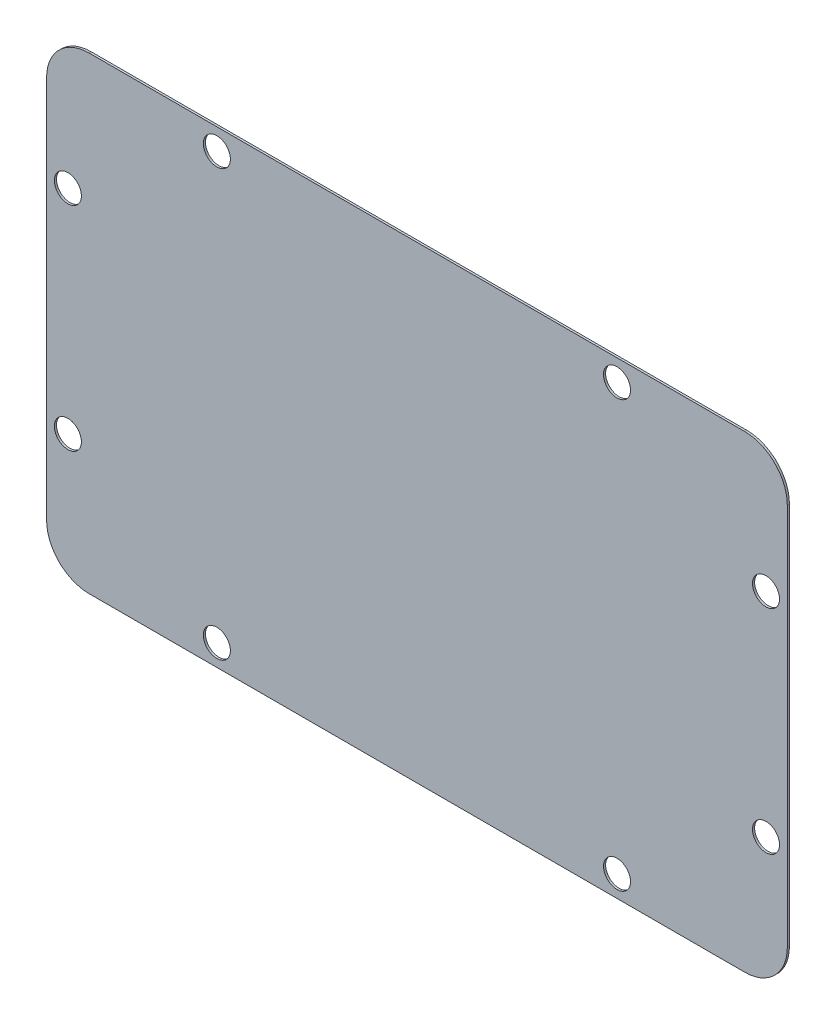
ISO-10303-21;
HEADER;
FILE_DESCRIPTION(('STEP AP214'),'2;1');
FILE_NAME('part.step','',(''),(''),'','','');
FILE_SCHEMA(('AUTOMOTIVE_DESIGN { 1 0 10303 214 1 1 1 1 }'));
ENDSEC;
DATA;
#1=APPLICATION_CONTEXT('core data for automotive mechanical design processes');
#2=APPLICATION_PROTOCOL_DEFINITION('international standard','automotive_design',2000,#1);
#3=PRODUCT_CONTEXT('',#1,'mechanical');
#4=PRODUCT('Part','Part','',(#3));
#5=PRODUCT_RELATED_PRODUCT_CATEGORY('part','',(#4));
#6=PRODUCT_DEFINITION_FORMATION('','',#4);
#7=PRODUCT_DEFINITION_CONTEXT('part definition',#1,'design');
#8=PRODUCT_DEFINITION('design','',#6,#7);
#9=PRODUCT_DEFINITION_SHAPE('','',#8);
#10=(LENGTH_UNIT() NAMED_UNIT(*) SI_UNIT(.MILLI.,.METRE.));
#11=(NAMED_UNIT(*) PLANE_ANGLE_UNIT() SI_UNIT($,.RADIAN.));
#12=(NAMED_UNIT(*) SI_UNIT($,.STERADIAN.) SOLID_ANGLE_UNIT());
#13=UNCERTAINTY_MEASURE_WITH_UNIT(LENGTH_MEASURE(1.E-05),#10,'distance_accuracy_value','');
#14=(GEOMETRIC_REPRESENTATION_CONTEXT(3) GLOBAL_UNCERTAINTY_ASSIGNED_CONTEXT((#13)) GLOBAL_UNIT_ASSIGNED_CONTEXT((#10,
#11,#12)) REPRESENTATION_CONTEXT('',''));
#15=CARTESIAN_POINT('',(0.,0.,0.));
#16=DIRECTION('',(0.,0.,1.));
#17=DIRECTION('',(1.,0.,0.));
#18=AXIS2_PLACEMENT_3D('',#15,#16,#17);
#19=CARTESIAN_POINT('',(-10.,10.,0.5));
#20=DIRECTION('',(0.,0.,-1.));
#21=DIRECTION('',(-1.,0.,0.));
#22=AXIS2_PLACEMENT_3D('',#19,#20,#21);
#23=CYLINDRICAL_SURFACE('',#22,10.);
#24=CARTESIAN_POINT('',(-10.,10.,0.));
#25=DIRECTION('',(0.,0.,1.));
#26=DIRECTION('',(1.,0.,0.));
#27=AXIS2_PLACEMENT_3D('',#24,#25,#26);
#28=CIRCLE('',#27,10.);
#29=CARTESIAN_POINT('',(-10.0000000000001,0.,0.));
#30=VERTEX_POINT('',#29);
#31=CARTESIAN_POINT('',(0.,10.0000000000001,0.));
#32=VERTEX_POINT('',#31);
#33=EDGE_CURVE('E132',#30,#32,#28,.T.);
#34=ORIENTED_EDGE('',*,*,#33,.T.);
#35=DIRECTION('',(0.,0.,-1.));
#36=VECTOR('',#35,1.);
#37=CARTESIAN_POINT('',(0.,10.0000000000001,0.5));
#38=LINE('',#37,#36);
#39=CARTESIAN_POINT('',(0.,10.0000000000001,0.5));
#40=VERTEX_POINT('',#39);
#41=EDGE_CURVE('E11',#40,#32,#38,.T.);
#42=ORIENTED_EDGE('',*,*,#41,.F.);
#43=CARTESIAN_POINT('',(-10.,10.,0.5));
#44=DIRECTION('',(0.,0.,1.));
#45=DIRECTION('',(1.,0.,0.));
#46=AXIS2_PLACEMENT_3D('',#43,#44,#45);
#47=CIRCLE('',#46,10.);
#48=CARTESIAN_POINT('',(-10.0000000000001,0.,0.5));
#49=VERTEX_POINT('',#48);
#50=EDGE_CURVE('E147',#49,#40,#47,.T.);
#51=ORIENTED_EDGE('',*,*,#50,.F.);
#52=DIRECTION('',(0.,0.,-1.));
#53=VECTOR('',#52,1.);
#54=CARTESIAN_POINT('',(-10.0000000000001,0.,0.5));
#55=LINE('',#54,#53);
#56=EDGE_CURVE('E128',#49,#30,#55,.T.);
#57=ORIENTED_EDGE('',*,*,#56,.T.);
#58=EDGE_LOOP('',(#34,#42,#51,#57));
#59=FACE_BOUND('',#58,.T.);
#60=ADVANCED_FACE('F34',(#59),#23,.T.);
#61=CARTESIAN_POINT('',(0.,10.0000000000001,0.5));
#62=DIRECTION('',(-1.,0.,0.));
#63=DIRECTION('',(0.,0.,1.));
#64=AXIS2_PLACEMENT_3D('',#61,#62,#63);
#65=PLANE('',#64);
#66=DIRECTION('',(0.,1.,0.));
#67=VECTOR('',#66,1.);
#68=CARTESIAN_POINT('',(0.,10.0000000000001,0.));
#69=LINE('',#68,#67);
#70=CARTESIAN_POINT('',(0.,100.,0.));
#71=VERTEX_POINT('',#70);
#72=EDGE_CURVE('E135',#32,#71,#69,.T.);
#73=ORIENTED_EDGE('',*,*,#72,.T.);
#74=DIRECTION('',(0.,0.,-1.));
#75=VECTOR('',#74,1.);
#76=CARTESIAN_POINT('',(0.,100.,0.5));
#77=LINE('',#76,#75);
#78=CARTESIAN_POINT('',(0.,100.,0.5));
#79=VERTEX_POINT('',#78);
#80=EDGE_CURVE('E43',#79,#71,#77,.T.);
#81=ORIENTED_EDGE('',*,*,#80,.F.);
#82=DIRECTION('',(0.,1.,0.));
#83=VECTOR('',#82,1.);
#84=CARTESIAN_POINT('',(0.,10.0000000000001,0.5));
#85=LINE('',#84,#83);
#86=EDGE_CURVE('E95',#40,#79,#85,.T.);
#87=ORIENTED_EDGE('',*,*,#86,.F.);
#88=ORIENTED_EDGE('',*,*,#41,.T.);
#89=EDGE_LOOP('',(#73,#81,#87,#88));
#90=FACE_BOUND('',#89,.T.);
#91=ADVANCED_FACE('F240',(#90),#65,.F.);
#92=CARTESIAN_POINT('',(-10.,100.,0.5));
#93=DIRECTION('',(0.,0.,-1.));
#94=DIRECTION('',(-1.,0.,0.));
#95=AXIS2_PLACEMENT_3D('',#92,#93,#94);
#96=CYLINDRICAL_SURFACE('',#95,10.);
#97=CARTESIAN_POINT('',(-10.,100.,0.));
#98=DIRECTION('',(0.,0.,1.));
#99=DIRECTION('',(1.,0.,0.));
#100=AXIS2_PLACEMENT_3D('',#97,#98,#99);
#101=CIRCLE('',#100,10.);
#102=CARTESIAN_POINT('',(-10.,110.,0.));
#103=VERTEX_POINT('',#102);
#104=EDGE_CURVE('E138',#71,#103,#101,.T.);
#105=ORIENTED_EDGE('',*,*,#104,.T.);
#106=DIRECTION('',(0.,0.,-1.));
#107=VECTOR('',#106,1.);
#108=CARTESIAN_POINT('',(-10.,110.,0.5));
#109=LINE('',#108,#107);
#110=CARTESIAN_POINT('',(-10.,110.,0.5));
#111=VERTEX_POINT('',#110);
#112=EDGE_CURVE('E154',#111,#103,#109,.T.);
#113=ORIENTED_EDGE('',*,*,#112,.F.);
#114=CARTESIAN_POINT('',(-10.,100.,0.5));
#115=DIRECTION('',(0.,0.,1.));
#116=DIRECTION('',(1.,0.,0.));
#117=AXIS2_PLACEMENT_3D('',#114,#115,#116);
#118=CIRCLE('',#117,10.);
#119=EDGE_CURVE('E208',#79,#111,#118,.T.);
#120=ORIENTED_EDGE('',*,*,#119,.F.);
#121=ORIENTED_EDGE('',*,*,#80,.T.);
#122=EDGE_LOOP('',(#105,#113,#120,#121));
#123=FACE_BOUND('',#122,.T.);
#124=ADVANCED_FACE('F244',(#123),#96,.T.);
#125=CARTESIAN_POINT('',(-10.,110.,0.5));
#126=DIRECTION('',(0.,-1.,0.));
#127=DIRECTION('',(1.,0.,0.));
#128=AXIS2_PLACEMENT_3D('',#125,#126,#127);
#129=PLANE('',#128);
#130=DIRECTION('',(-1.,0.,0.));
#131=VECTOR('',#130,1.);
#132=CARTESIAN_POINT('',(-10.,110.,0.));
#133=LINE('',#132,#131);
#134=CARTESIAN_POINT('',(-164.,110.,0.));
#135=VERTEX_POINT('',#134);
#136=EDGE_CURVE('E140',#103,#135,#133,.T.);
#137=ORIENTED_EDGE('',*,*,#136,.T.);
#138=DIRECTION('',(0.,0.,-1.));
#139=VECTOR('',#138,1.);
#140=CARTESIAN_POINT('',(-164.,110.,0.5));
#141=LINE('',#140,#139);
#142=CARTESIAN_POINT('',(-164.,110.,0.5));
#143=VERTEX_POINT('',#142);
#144=EDGE_CURVE('E151',#143,#135,#141,.T.);
#145=ORIENTED_EDGE('',*,*,#144,.F.);
#146=DIRECTION('',(-1.,0.,0.));
#147=VECTOR('',#146,1.);
#148=CARTESIAN_POINT('',(-10.,110.,0.5));
#149=LINE('',#148,#147);
#150=EDGE_CURVE('E210',#111,#143,#149,.T.);
#151=ORIENTED_EDGE('',*,*,#150,.F.);
#152=ORIENTED_EDGE('',*,*,#112,.T.);
#153=EDGE_LOOP('',(#137,#145,#151,#152));
#154=FACE_BOUND('',#153,.T.);
#155=ADVANCED_FACE('F216',(#154),#129,.F.);
#156=CARTESIAN_POINT('',(-164.,100.,0.5));
#157=DIRECTION('',(0.,0.,-1.));
#158=DIRECTION('',(-1.,0.,0.));
#159=AXIS2_PLACEMENT_3D('',#156,#157,#158);
#160=CYLINDRICAL_SURFACE('',#159,10.);
#161=CARTESIAN_POINT('',(-164.,100.,0.));
#162=DIRECTION('',(0.,0.,1.));
#163=DIRECTION('',(1.,0.,0.));
#164=AXIS2_PLACEMENT_3D('',#161,#162,#163);
#165=CIRCLE('',#164,10.);
#166=CARTESIAN_POINT('',(-174.,100.,0.));
#167=VERTEX_POINT('',#166);
#168=EDGE_CURVE('E142',#135,#167,#165,.T.);
#169=ORIENTED_EDGE('',*,*,#168,.T.);
#170=DIRECTION('',(0.,0.,-1.));
#171=VECTOR('',#170,1.);
#172=CARTESIAN_POINT('',(-174.,100.,0.5));
#173=LINE('',#172,#171);
#174=CARTESIAN_POINT('',(-174.,100.,0.5));
#175=VERTEX_POINT('',#174);
#176=EDGE_CURVE('E123',#175,#167,#173,.T.);
#177=ORIENTED_EDGE('',*,*,#176,.F.);
#178=CARTESIAN_POINT('',(-164.,100.,0.5));
#179=DIRECTION('',(0.,0.,1.));
#180=DIRECTION('',(1.,0.,0.));
#181=AXIS2_PLACEMENT_3D('',#178,#179,#180);
#182=CIRCLE('',#181,10.);
#183=EDGE_CURVE('E114',#143,#175,#182,.T.);
#184=ORIENTED_EDGE('',*,*,#183,.F.);
#185=ORIENTED_EDGE('',*,*,#144,.T.);
#186=EDGE_LOOP('',(#169,#177,#184,#185));
#187=FACE_BOUND('',#186,.T.);
#188=ADVANCED_FACE('F220',(#187),#160,.T.);
#189=CARTESIAN_POINT('',(-174.,9.99999999999999,0.5));
#190=DIRECTION('',(1.,0.,0.));
#191=DIRECTION('',(0.,0.,-1.));
#192=AXIS2_PLACEMENT_3D('',#189,#190,#191);
#193=PLANE('',#192);
#194=DIRECTION('',(0.,-1.,0.));
#195=VECTOR('',#194,1.);
#196=CARTESIAN_POINT('',(-174.,9.99999999999999,0.));
#197=LINE('',#196,#195);
#198=CARTESIAN_POINT('',(-174.,9.99999999999999,0.));
#199=VERTEX_POINT('',#198);
#200=EDGE_CURVE('E122',#167,#199,#197,.T.);
#201=ORIENTED_EDGE('',*,*,#200,.T.);
#202=DIRECTION('',(0.,0.,-1.));
#203=VECTOR('',#202,1.);
#204=CARTESIAN_POINT('',(-174.,9.99999999999999,0.5));
#205=LINE('',#204,#203);
#206=CARTESIAN_POINT('',(-174.,9.99999999999999,0.5));
#207=VERTEX_POINT('',#206);
#208=EDGE_CURVE('E119',#207,#199,#205,.T.);
#209=ORIENTED_EDGE('',*,*,#208,.F.);
#210=DIRECTION('',(0.,-1.,0.));
#211=VECTOR('',#210,1.);
#212=CARTESIAN_POINT('',(-174.,9.99999999999999,0.5));
#213=LINE('',#212,#211);
#214=EDGE_CURVE('E108',#175,#207,#213,.T.);
#215=ORIENTED_EDGE('',*,*,#214,.F.);
#216=ORIENTED_EDGE('',*,*,#176,.T.);
#217=EDGE_LOOP('',(#201,#209,#215,#216));
#218=FACE_BOUND('',#217,.T.);
#219=ADVANCED_FACE('F120',(#218),#193,.F.);
#220=CARTESIAN_POINT('',(-164.,9.99999999999999,0.5));
#221=DIRECTION('',(0.,0.,-1.));
#222=DIRECTION('',(-1.,0.,0.));
#223=AXIS2_PLACEMENT_3D('',#220,#221,#222);
#224=CYLINDRICAL_SURFACE('',#223,10.);
#225=CARTESIAN_POINT('',(-164.,9.99999999999999,0.));
#226=DIRECTION('',(0.,0.,1.));
#227=DIRECTION('',(-1.,0.,0.));
#228=AXIS2_PLACEMENT_3D('',#225,#226,#227);
#229=CIRCLE('',#228,10.);
#230=CARTESIAN_POINT('',(-164.,0.,0.));
#231=VERTEX_POINT('',#230);
#232=EDGE_CURVE('E81',#199,#231,#229,.T.);
#233=ORIENTED_EDGE('',*,*,#232,.T.);
#234=DIRECTION('',(0.,0.,-1.));
#235=VECTOR('',#234,1.);
#236=CARTESIAN_POINT('',(-164.,0.,0.5));
#237=LINE('',#236,#235);
#238=CARTESIAN_POINT('',(-164.,0.,0.5));
#239=VERTEX_POINT('',#238);
#240=EDGE_CURVE('E124',#239,#231,#237,.T.);
#241=ORIENTED_EDGE('',*,*,#240,.F.);
#242=CARTESIAN_POINT('',(-164.,9.99999999999999,0.5));
#243=DIRECTION('',(0.,0.,1.));
#244=DIRECTION('',(-1.,0.,0.));
#245=AXIS2_PLACEMENT_3D('',#242,#243,#244);
#246=CIRCLE('',#245,10.);
#247=EDGE_CURVE('E112',#207,#239,#246,.T.);
#248=ORIENTED_EDGE('',*,*,#247,.F.);
#249=ORIENTED_EDGE('',*,*,#208,.T.);
#250=EDGE_LOOP('',(#233,#241,#248,#249));
#251=FACE_BOUND('',#250,.T.);
#252=ADVANCED_FACE('F126',(#251),#224,.T.);
#253=CARTESIAN_POINT('',(-10.0000000000001,0.,0.5));
#254=DIRECTION('',(0.,1.,0.));
#255=DIRECTION('',(-1.,0.,0.));
#256=AXIS2_PLACEMENT_3D('',#253,#254,#255);
#257=PLANE('',#256);
#258=DIRECTION('',(1.,0.,0.));
#259=VECTOR('',#258,1.);
#260=CARTESIAN_POINT('',(-10.0000000000001,0.,0.));
#261=LINE('',#260,#259);
#262=EDGE_CURVE('E87',#231,#30,#261,.T.);
#263=ORIENTED_EDGE('',*,*,#262,.T.);
#264=ORIENTED_EDGE('',*,*,#56,.F.);
#265=DIRECTION('',(1.,0.,0.));
#266=VECTOR('',#265,1.);
#267=CARTESIAN_POINT('',(-10.0000000000001,0.,0.5));
#268=LINE('',#267,#266);
#269=EDGE_CURVE('E52',#239,#49,#268,.T.);
#270=ORIENTED_EDGE('',*,*,#269,.F.);
#271=ORIENTED_EDGE('',*,*,#240,.T.);
#272=EDGE_LOOP('',(#263,#264,#270,#271));
#273=FACE_BOUND('',#272,.T.);
#274=ADVANCED_FACE('F228',(#273),#257,.F.);
#275=CARTESIAN_POINT('',(-10.,10.,0.5));
#276=DIRECTION('',(0.,0.,1.));
#277=DIRECTION('',(1.,0.,0.));
#278=AXIS2_PLACEMENT_3D('',#275,#276,#277);
#279=PLANE('',#278);
#280=CARTESIAN_POINT('',(-169.,80.,0.500000000000001));
#281=DIRECTION('',(0.,0.,1.));
#282=DIRECTION('',(1.,0.,0.));
#283=AXIS2_PLACEMENT_3D('',#280,#281,#282);
#284=CIRCLE('',#283,3.17499999999998);
#285=CARTESIAN_POINT('',(-165.825,80.,0.500000000000001));
#286=VERTEX_POINT('',#285);
#287=EDGE_CURVE('E175',#286,#286,#284,.T.);
#288=ORIENTED_EDGE('',*,*,#287,.F.);
#289=EDGE_LOOP('',(#288));
#290=FACE_BOUND('',#289,.T.);
#291=CARTESIAN_POINT('',(-134.,105.,0.500000000000001));
#292=DIRECTION('',(0.,0.,1.));
#293=DIRECTION('',(1.,0.,0.));
#294=AXIS2_PLACEMENT_3D('',#291,#292,#293);
#295=CIRCLE('',#294,3.17499999999998);
#296=CARTESIAN_POINT('',(-130.825,105.,0.500000000000001));
#297=VERTEX_POINT('',#296);
#298=EDGE_CURVE('E165',#297,#297,#295,.T.);
#299=ORIENTED_EDGE('',*,*,#298,.F.);
#300=EDGE_LOOP('',(#299));
#301=FACE_BOUND('',#300,.T.);
#302=CARTESIAN_POINT('',(-40.,105.,0.500000000000001));
#303=DIRECTION('',(0.,0.,1.));
#304=DIRECTION('',(1.,0.,0.));
#305=AXIS2_PLACEMENT_3D('',#302,#303,#304);
#306=CIRCLE('',#305,3.17499999999999);
#307=CARTESIAN_POINT('',(-36.825,105.,0.500000000000001));
#308=VERTEX_POINT('',#307);
#309=EDGE_CURVE('E162',#308,#308,#306,.T.);
#310=ORIENTED_EDGE('',*,*,#309,.F.);
#311=EDGE_LOOP('',(#310));
#312=FACE_BOUND('',#311,.T.);
#313=CARTESIAN_POINT('',(-5.,80.,0.500000000000001));
#314=DIRECTION('',(0.,0.,1.));
#315=DIRECTION('',(1.,0.,0.));
#316=AXIS2_PLACEMENT_3D('',#313,#314,#315);
#317=CIRCLE('',#316,3.17499999999999);
#318=CARTESIAN_POINT('',(-1.82500000000001,80.,0.500000000000001));
#319=VERTEX_POINT('',#318);
#320=EDGE_CURVE('E161',#319,#319,#317,.T.);
#321=ORIENTED_EDGE('',*,*,#320,.F.);
#322=EDGE_LOOP('',(#321));
#323=FACE_BOUND('',#322,.T.);
#324=CARTESIAN_POINT('',(-5.,30.,0.500000000000001));
#325=DIRECTION('',(0.,0.,1.));
#326=DIRECTION('',(1.,0.,0.));
#327=AXIS2_PLACEMENT_3D('',#324,#325,#326);
#328=CIRCLE('',#327,3.17499999999999);
#329=CARTESIAN_POINT('',(-1.82500000000001,30.,0.500000000000001));
#330=VERTEX_POINT('',#329);
#331=EDGE_CURVE('E183',#330,#330,#328,.T.);
#332=ORIENTED_EDGE('',*,*,#331,.F.);
#333=EDGE_LOOP('',(#332));
#334=FACE_BOUND('',#333,.T.);
#335=CARTESIAN_POINT('',(-169.,30.,0.500000000000001));
#336=DIRECTION('',(0.,0.,1.));
#337=DIRECTION('',(1.,0.,0.));
#338=AXIS2_PLACEMENT_3D('',#335,#336,#337);
#339=CIRCLE('',#338,3.17499999999998);
#340=CARTESIAN_POINT('',(-165.825,30.,0.500000000000001));
#341=VERTEX_POINT('',#340);
#342=EDGE_CURVE('E189',#341,#341,#339,.T.);
#343=ORIENTED_EDGE('',*,*,#342,.F.);
#344=EDGE_LOOP('',(#343));
#345=FACE_BOUND('',#344,.T.);
#346=CARTESIAN_POINT('',(-134.,4.99999999999998,0.500000000000001));
#347=DIRECTION('',(0.,0.,1.));
#348=DIRECTION('',(1.,0.,0.));
#349=AXIS2_PLACEMENT_3D('',#346,#347,#348);
#350=CIRCLE('',#349,3.17499999999998);
#351=CARTESIAN_POINT('',(-130.825,4.99999999999998,0.500000000000001));
#352=VERTEX_POINT('',#351);
#353=EDGE_CURVE('E195',#352,#352,#350,.T.);
#354=ORIENTED_EDGE('',*,*,#353,.F.);
#355=EDGE_LOOP('',(#354));
#356=FACE_BOUND('',#355,.T.);
#357=CARTESIAN_POINT('',(-40.,5.,0.500000000000001));
#358=DIRECTION('',(0.,0.,1.));
#359=DIRECTION('',(1.,0.,0.));
#360=AXIS2_PLACEMENT_3D('',#357,#358,#359);
#361=CIRCLE('',#360,3.17499999999999);
#362=CARTESIAN_POINT('',(-36.825,5.,0.500000000000001));
#363=VERTEX_POINT('',#362);
#364=EDGE_CURVE('E201',#363,#363,#361,.T.);
#365=ORIENTED_EDGE('',*,*,#364,.F.);
#366=EDGE_LOOP('',(#365));
#367=FACE_BOUND('',#366,.T.);
#368=ORIENTED_EDGE('',*,*,#50,.T.);
#369=ORIENTED_EDGE('',*,*,#86,.T.);
#370=ORIENTED_EDGE('',*,*,#119,.T.);
#371=ORIENTED_EDGE('',*,*,#150,.T.);
#372=ORIENTED_EDGE('',*,*,#183,.T.);
#373=ORIENTED_EDGE('',*,*,#214,.T.);
#374=ORIENTED_EDGE('',*,*,#247,.T.);
#375=ORIENTED_EDGE('',*,*,#269,.T.);
#376=EDGE_LOOP('',(#368,#369,#370,#371,#372,#373,#374,#375));
#377=FACE_BOUND('',#376,.T.);
#378=ADVANCED_FACE('F110',(#290,#301,#312,#323,#334,#345,#356,#367,#377),#279,.T.);
#379=CARTESIAN_POINT('',(-10.,10.,0.));
#380=DIRECTION('',(0.,0.,1.));
#381=DIRECTION('',(1.,0.,0.));
#382=AXIS2_PLACEMENT_3D('',#379,#380,#381);
#383=PLANE('',#382);
#384=CARTESIAN_POINT('',(-169.,80.,0.));
#385=DIRECTION('',(0.,0.,1.));
#386=DIRECTION('',(1.,0.,0.));
#387=AXIS2_PLACEMENT_3D('',#384,#385,#386);
#388=CIRCLE('',#387,3.17499999999998);
#389=CARTESIAN_POINT('',(-165.825,80.,0.));
#390=VERTEX_POINT('',#389);
#391=EDGE_CURVE('E37',#390,#390,#388,.T.);
#392=ORIENTED_EDGE('',*,*,#391,.T.);
#393=EDGE_LOOP('',(#392));
#394=FACE_BOUND('',#393,.T.);
#395=CARTESIAN_POINT('',(-134.,105.,0.));
#396=DIRECTION('',(0.,0.,1.));
#397=DIRECTION('',(1.,0.,0.));
#398=AXIS2_PLACEMENT_3D('',#395,#396,#397);
#399=CIRCLE('',#398,3.17499999999998);
#400=CARTESIAN_POINT('',(-130.825,105.,0.));
#401=VERTEX_POINT('',#400);
#402=EDGE_CURVE('E163',#401,#401,#399,.T.);
#403=ORIENTED_EDGE('',*,*,#402,.T.);
#404=EDGE_LOOP('',(#403));
#405=FACE_BOUND('',#404,.T.);
#406=CARTESIAN_POINT('',(-40.,105.,0.));
#407=DIRECTION('',(0.,0.,1.));
#408=DIRECTION('',(1.,0.,0.));
#409=AXIS2_PLACEMENT_3D('',#406,#407,#408);
#410=CIRCLE('',#409,3.17499999999999);
#411=CARTESIAN_POINT('',(-36.825,105.,0.));
#412=VERTEX_POINT('',#411);
#413=EDGE_CURVE('E159',#412,#412,#410,.T.);
#414=ORIENTED_EDGE('',*,*,#413,.T.);
#415=EDGE_LOOP('',(#414));
#416=FACE_BOUND('',#415,.T.);
#417=CARTESIAN_POINT('',(-5.,80.,0.));
#418=DIRECTION('',(0.,0.,1.));
#419=DIRECTION('',(1.,0.,0.));
#420=AXIS2_PLACEMENT_3D('',#417,#418,#419);
#421=CIRCLE('',#420,3.17499999999999);
#422=CARTESIAN_POINT('',(-1.82500000000001,80.,0.));
#423=VERTEX_POINT('',#422);
#424=EDGE_CURVE('E180',#423,#423,#421,.T.);
#425=ORIENTED_EDGE('',*,*,#424,.T.);
#426=EDGE_LOOP('',(#425));
#427=FACE_BOUND('',#426,.T.);
#428=CARTESIAN_POINT('',(-5.,30.,0.));
#429=DIRECTION('',(0.,0.,1.));
#430=DIRECTION('',(1.,0.,0.));
#431=AXIS2_PLACEMENT_3D('',#428,#429,#430);
#432=CIRCLE('',#431,3.17499999999999);
#433=CARTESIAN_POINT('',(-1.82500000000001,30.,0.));
#434=VERTEX_POINT('',#433);
#435=EDGE_CURVE('E186',#434,#434,#432,.T.);
#436=ORIENTED_EDGE('',*,*,#435,.T.);
#437=EDGE_LOOP('',(#436));
#438=FACE_BOUND('',#437,.T.);
#439=CARTESIAN_POINT('',(-169.,30.,0.));
#440=DIRECTION('',(0.,0.,1.));
#441=DIRECTION('',(1.,0.,0.));
#442=AXIS2_PLACEMENT_3D('',#439,#440,#441);
#443=CIRCLE('',#442,3.17499999999998);
#444=CARTESIAN_POINT('',(-165.825,30.,0.));
#445=VERTEX_POINT('',#444);
#446=EDGE_CURVE('E192',#445,#445,#443,.T.);
#447=ORIENTED_EDGE('',*,*,#446,.T.);
#448=EDGE_LOOP('',(#447));
#449=FACE_BOUND('',#448,.T.);
#450=CARTESIAN_POINT('',(-134.,4.99999999999998,0.));
#451=DIRECTION('',(0.,0.,1.));
#452=DIRECTION('',(1.,0.,0.));
#453=AXIS2_PLACEMENT_3D('',#450,#451,#452);
#454=CIRCLE('',#453,3.17499999999998);
#455=CARTESIAN_POINT('',(-130.825,4.99999999999998,0.));
#456=VERTEX_POINT('',#455);
#457=EDGE_CURVE('E198',#456,#456,#454,.T.);
#458=ORIENTED_EDGE('',*,*,#457,.T.);
#459=EDGE_LOOP('',(#458));
#460=FACE_BOUND('',#459,.T.);
#461=CARTESIAN_POINT('',(-40.,5.,0.));
#462=DIRECTION('',(0.,0.,1.));
#463=DIRECTION('',(1.,0.,0.));
#464=AXIS2_PLACEMENT_3D('',#461,#462,#463);
#465=CIRCLE('',#464,3.17499999999999);
#466=CARTESIAN_POINT('',(-36.825,5.,0.));
#467=VERTEX_POINT('',#466);
#468=EDGE_CURVE('E136',#467,#467,#465,.T.);
#469=ORIENTED_EDGE('',*,*,#468,.T.);
#470=EDGE_LOOP('',(#469));
#471=FACE_BOUND('',#470,.T.);
#472=ORIENTED_EDGE('',*,*,#33,.F.);
#473=ORIENTED_EDGE('',*,*,#262,.F.);
#474=ORIENTED_EDGE('',*,*,#232,.F.);
#475=ORIENTED_EDGE('',*,*,#200,.F.);
#476=ORIENTED_EDGE('',*,*,#168,.F.);
#477=ORIENTED_EDGE('',*,*,#136,.F.);
#478=ORIENTED_EDGE('',*,*,#104,.F.);
#479=ORIENTED_EDGE('',*,*,#72,.F.);
#480=EDGE_LOOP('',(#472,#473,#474,#475,#476,#477,#478,#479));
#481=FACE_BOUND('',#480,.T.);
#482=ADVANCED_FACE('F223',(#394,#405,#416,#427,#438,#449,#460,#471,#481),#383,.F.);
#483=CARTESIAN_POINT('',(-40.,5.,0.5));
#484=DIRECTION('',(0.,0.,1.));
#485=DIRECTION('',(1.,0.,0.));
#486=AXIS2_PLACEMENT_3D('',#483,#484,#485);
#487=CYLINDRICAL_SURFACE('',#486,3.17499999999999);
#488=ORIENTED_EDGE('',*,*,#364,.T.);
#489=EDGE_LOOP('',(#488));
#490=FACE_BOUND('',#489,.T.);
#491=ORIENTED_EDGE('',*,*,#468,.F.);
#492=EDGE_LOOP('',(#491));
#493=FACE_BOUND('',#492,.T.);
#494=ADVANCED_FACE('F283',(#490,#493),#487,.F.);
#495=CARTESIAN_POINT('',(-134.,4.99999999999998,0.5));
#496=DIRECTION('',(0.,0.,1.));
#497=DIRECTION('',(1.,0.,0.));
#498=AXIS2_PLACEMENT_3D('',#495,#496,#497);
#499=CYLINDRICAL_SURFACE('',#498,3.17499999999998);
#500=ORIENTED_EDGE('',*,*,#353,.T.);
#501=EDGE_LOOP('',(#500));
#502=FACE_BOUND('',#501,.T.);
#503=ORIENTED_EDGE('',*,*,#457,.F.);
#504=EDGE_LOOP('',(#503));
#505=FACE_BOUND('',#504,.T.);
#506=ADVANCED_FACE('F292',(#502,#505),#499,.F.);
#507=CARTESIAN_POINT('',(-169.,30.,0.5));
#508=DIRECTION('',(0.,0.,1.));
#509=DIRECTION('',(1.,0.,0.));
#510=AXIS2_PLACEMENT_3D('',#507,#508,#509);
#511=CYLINDRICAL_SURFACE('',#510,3.17499999999998);
#512=ORIENTED_EDGE('',*,*,#342,.T.);
#513=EDGE_LOOP('',(#512));
#514=FACE_BOUND('',#513,.T.);
#515=ORIENTED_EDGE('',*,*,#446,.F.);
#516=EDGE_LOOP('',(#515));
#517=FACE_BOUND('',#516,.T.);
#518=ADVANCED_FACE('F302',(#514,#517),#511,.F.);
#519=CARTESIAN_POINT('',(-5.,30.,0.5));
#520=DIRECTION('',(0.,0.,1.));
#521=DIRECTION('',(1.,0.,0.));
#522=AXIS2_PLACEMENT_3D('',#519,#520,#521);
#523=CYLINDRICAL_SURFACE('',#522,3.17499999999999);
#524=ORIENTED_EDGE('',*,*,#331,.T.);
#525=EDGE_LOOP('',(#524));
#526=FACE_BOUND('',#525,.T.);
#527=ORIENTED_EDGE('',*,*,#435,.F.);
#528=EDGE_LOOP('',(#527));
#529=FACE_BOUND('',#528,.T.);
#530=ADVANCED_FACE('F312',(#526,#529),#523,.F.);
#531=CARTESIAN_POINT('',(-5.,80.,0.5));
#532=DIRECTION('',(0.,0.,1.));
#533=DIRECTION('',(1.,0.,0.));
#534=AXIS2_PLACEMENT_3D('',#531,#532,#533);
#535=CYLINDRICAL_SURFACE('',#534,3.17499999999999);
#536=ORIENTED_EDGE('',*,*,#320,.T.);
#537=EDGE_LOOP('',(#536));
#538=FACE_BOUND('',#537,.T.);
#539=ORIENTED_EDGE('',*,*,#424,.F.);
#540=EDGE_LOOP('',(#539));
#541=FACE_BOUND('',#540,.T.);
#542=ADVANCED_FACE('F322',(#538,#541),#535,.F.);
#543=CARTESIAN_POINT('',(-40.,105.,0.5));
#544=DIRECTION('',(0.,0.,1.));
#545=DIRECTION('',(1.,0.,0.));
#546=AXIS2_PLACEMENT_3D('',#543,#544,#545);
#547=CYLINDRICAL_SURFACE('',#546,3.17499999999999);
#548=ORIENTED_EDGE('',*,*,#309,.T.);
#549=EDGE_LOOP('',(#548));
#550=FACE_BOUND('',#549,.T.);
#551=ORIENTED_EDGE('',*,*,#413,.F.);
#552=EDGE_LOOP('',(#551));
#553=FACE_BOUND('',#552,.T.);
#554=ADVANCED_FACE('F332',(#550,#553),#547,.F.);
#555=CARTESIAN_POINT('',(-134.,105.,0.5));
#556=DIRECTION('',(0.,0.,1.));
#557=DIRECTION('',(1.,0.,0.));
#558=AXIS2_PLACEMENT_3D('',#555,#556,#557);
#559=CYLINDRICAL_SURFACE('',#558,3.17499999999998);
#560=ORIENTED_EDGE('',*,*,#298,.T.);
#561=EDGE_LOOP('',(#560));
#562=FACE_BOUND('',#561,.T.);
#563=ORIENTED_EDGE('',*,*,#402,.F.);
#564=EDGE_LOOP('',(#563));
#565=FACE_BOUND('',#564,.T.);
#566=ADVANCED_FACE('F342',(#562,#565),#559,.F.);
#567=CARTESIAN_POINT('',(-169.,80.,0.5));
#568=DIRECTION('',(0.,0.,1.));
#569=DIRECTION('',(1.,0.,0.));
#570=AXIS2_PLACEMENT_3D('',#567,#568,#569);
#571=CYLINDRICAL_SURFACE('',#570,3.17499999999998);
#572=ORIENTED_EDGE('',*,*,#287,.T.);
#573=EDGE_LOOP('',(#572));
#574=FACE_BOUND('',#573,.T.);
#575=ORIENTED_EDGE('',*,*,#391,.F.);
#576=EDGE_LOOP('',(#575));
#577=FACE_BOUND('',#576,.T.);
#578=ADVANCED_FACE('F352',(#574,#577),#571,.F.);
#579=CLOSED_SHELL('',(#60,#91,#124,#155,#188,#219,#252,#274,#378,#482,#494,#506,#518,#530,#542,
#554,#566,#578));
#580=MANIFOLD_SOLID_BREP('B2',#579);
#581=ADVANCED_BREP_SHAPE_REPRESENTATION('',(#18,#580),#14);
#582=SHAPE_DEFINITION_REPRESENTATION(#9,#581);
ENDSEC;
END-ISO-10303-21;
